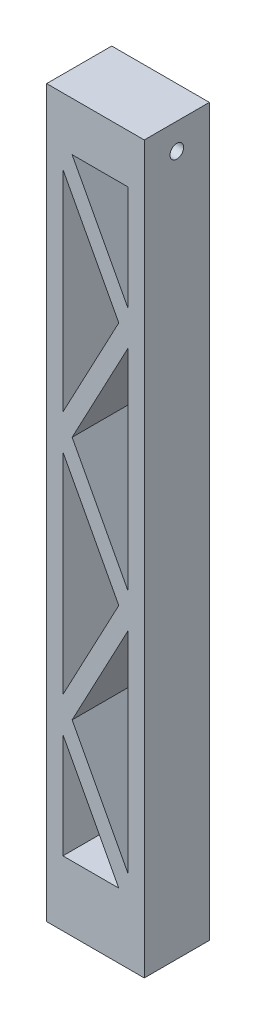
ISO-10303-21;
HEADER;
FILE_DESCRIPTION(('STEP AP214'),'2;1');
FILE_NAME('part.step','',(''),(''),'','','');
FILE_SCHEMA(('AUTOMOTIVE_DESIGN { 1 0 10303 214 1 1 1 1 }'));
ENDSEC;
DATA;
#1=APPLICATION_CONTEXT('core data for automotive mechanical design processes');
#2=APPLICATION_PROTOCOL_DEFINITION('international standard','automotive_design',2000,#1);
#3=PRODUCT_CONTEXT('',#1,'mechanical');
#4=PRODUCT('Part','Part','',(#3));
#5=PRODUCT_RELATED_PRODUCT_CATEGORY('part','',(#4));
#6=PRODUCT_DEFINITION_FORMATION('','',#4);
#7=PRODUCT_DEFINITION_CONTEXT('part definition',#1,'design');
#8=PRODUCT_DEFINITION('design','',#6,#7);
#9=PRODUCT_DEFINITION_SHAPE('','',#8);
#10=(LENGTH_UNIT() NAMED_UNIT(*) SI_UNIT(.MILLI.,.METRE.));
#11=(NAMED_UNIT(*) PLANE_ANGLE_UNIT() SI_UNIT($,.RADIAN.));
#12=(NAMED_UNIT(*) SI_UNIT($,.STERADIAN.) SOLID_ANGLE_UNIT());
#13=UNCERTAINTY_MEASURE_WITH_UNIT(LENGTH_MEASURE(1.E-05),#10,'distance_accuracy_value','');
#14=(GEOMETRIC_REPRESENTATION_CONTEXT(3) GLOBAL_UNCERTAINTY_ASSIGNED_CONTEXT((#13)) GLOBAL_UNIT_ASSIGNED_CONTEXT((#10,
#11,#12)) REPRESENTATION_CONTEXT('',''));
#15=CARTESIAN_POINT('',(0.,0.,0.));
#16=DIRECTION('',(0.,0.,1.));
#17=DIRECTION('',(1.,0.,0.));
#18=AXIS2_PLACEMENT_3D('',#15,#16,#17);
#19=CARTESIAN_POINT('',(-15.,223.,-10.));
#20=DIRECTION('',(0.,0.,1.));
#21=DIRECTION('',(1.,0.,0.));
#22=AXIS2_PLACEMENT_3D('',#19,#20,#21);
#23=PLANE('',#22);
#24=DIRECTION('',(0.,-1.,0.));
#25=VECTOR('',#24,1.);
#26=CARTESIAN_POINT('',(10.,0.,-10.));
#27=LINE('',#26,#25);
#28=CARTESIAN_POINT('',(10.,208.,-10.));
#29=VERTEX_POINT('',#28);
#30=CARTESIAN_POINT('',(10.,175.723532661682,-10.));
#31=VERTEX_POINT('',#30);
#32=EDGE_CURVE('E321',#29,#31,#27,.T.);
#33=ORIENTED_EDGE('',*,*,#32,.F.);
#34=DIRECTION('',(1.,0.,0.));
#35=VECTOR('',#34,1.);
#36=CARTESIAN_POINT('',(0.,208.,-10.));
#37=LINE('',#36,#35);
#38=CARTESIAN_POINT('',(-7.16833369059441,208.,-10.));
#39=VERTEX_POINT('',#38);
#40=EDGE_CURVE('E148',#39,#29,#37,.T.);
#41=ORIENTED_EDGE('',*,*,#40,.F.);
#42=DIRECTION('',(0.46961297297834,-0.88287238919928,0.));
#43=VECTOR('',#42,1.);
#44=CARTESIAN_POINT('',(80.6510765269855,42.8995087909497,-10.));
#45=LINE('',#44,#43);
#46=EDGE_CURVE('E314',#39,#31,#45,.T.);
#47=ORIENTED_EDGE('',*,*,#46,.T.);
#48=EDGE_LOOP('',(#33,#41,#47));
#49=FACE_BOUND('',#48,.T.);
#50=DIRECTION('',(-0.46961297297834,-0.88287238919928,0.));
#51=VECTOR('',#50,1.);
#52=CARTESIAN_POINT('',(-60.6474414687802,32.2592773770107,-10.));
#53=LINE('',#52,#51);
#54=CARTESIAN_POINT('',(10.,165.076467338318,-10.));
#55=VERTEX_POINT('',#54);
#56=CARTESIAN_POINT('',(-7.16833369059443,132.8,-10.));
#57=VERTEX_POINT('',#56);
#58=EDGE_CURVE('E349',#55,#57,#53,.T.);
#59=ORIENTED_EDGE('',*,*,#58,.T.);
#60=DIRECTION('',(0.46961297297834,-0.88287238919928,0.));
#61=VECTOR('',#60,1.);
#62=CARTESIAN_POINT('',(49.4725303025677,26.3151756928551,-10.));
#63=LINE('',#62,#61);
#64=CARTESIAN_POINT('',(10.,100.523532661682,-10.));
#65=VERTEX_POINT('',#64);
#66=EDGE_CURVE('E357',#57,#65,#63,.T.);
#67=ORIENTED_EDGE('',*,*,#66,.T.);
#68=DIRECTION('',(0.,-1.,0.));
#69=VECTOR('',#68,1.);
#70=CARTESIAN_POINT('',(9.99999999999999,0.,-10.));
#71=LINE('',#70,#69);
#72=EDGE_CURVE('E366',#55,#65,#71,.T.);
#73=ORIENTED_EDGE('',*,*,#72,.F.);
#74=EDGE_LOOP('',(#59,#67,#73));
#75=FACE_BOUND('',#74,.T.);
#76=DIRECTION('',(-0.46961297297834,-0.88287238919928,0.));
#77=VECTOR('',#76,1.);
#78=CARTESIAN_POINT('',(-29.4688952443624,15.6749442789162,-10.));
#79=LINE('',#78,#77);
#80=CARTESIAN_POINT('',(10.,89.8764673383176,-10.));
#81=VERTEX_POINT('',#80);
#82=CARTESIAN_POINT('',(-7.16833369059443,57.6,-10.));
#83=VERTEX_POINT('',#82);
#84=EDGE_CURVE('E398',#81,#83,#79,.T.);
#85=ORIENTED_EDGE('',*,*,#84,.T.);
#86=DIRECTION('',(0.46961297297834,-0.88287238919928,0.));
#87=VECTOR('',#86,1.);
#88=CARTESIAN_POINT('',(18.2939840781499,9.73084259476057,-10.));
#89=LINE('',#88,#87);
#90=CARTESIAN_POINT('',(10.,25.3235326616824,-10.));
#91=VERTEX_POINT('',#90);
#92=EDGE_CURVE('E406',#83,#91,#89,.T.);
#93=ORIENTED_EDGE('',*,*,#92,.T.);
#94=DIRECTION('',(0.,-1.,0.));
#95=VECTOR('',#94,1.);
#96=CARTESIAN_POINT('',(10.,0.,-10.));
#97=LINE('',#96,#95);
#98=EDGE_CURVE('E415',#81,#91,#97,.T.);
#99=ORIENTED_EDGE('',*,*,#98,.F.);
#100=EDGE_LOOP('',(#85,#93,#99));
#101=FACE_BOUND('',#100,.T.);
#102=DIRECTION('',(0.,1.,0.));
#103=VECTOR('',#102,1.);
#104=CARTESIAN_POINT('',(-10.,0.,-10.));
#105=LINE('',#104,#103);
#106=CARTESIAN_POINT('',(-10.,20.,-10.));
#107=VERTEX_POINT('',#106);
#108=CARTESIAN_POINT('',(-9.99999999999997,52.2764673383175,-10.));
#109=VERTEX_POINT('',#108);
#110=EDGE_CURVE('E440',#107,#109,#105,.T.);
#111=ORIENTED_EDGE('',*,*,#110,.F.);
#112=DIRECTION('',(-1.,0.,0.));
#113=VECTOR('',#112,1.);
#114=CARTESIAN_POINT('',(0.,20.,-10.));
#115=LINE('',#114,#113);
#116=CARTESIAN_POINT('',(7.16833369059444,20.,-10.));
#117=VERTEX_POINT('',#116);
#118=EDGE_CURVE('E423',#117,#107,#115,.T.);
#119=ORIENTED_EDGE('',*,*,#118,.F.);
#120=DIRECTION('',(0.469612972978341,-0.88287238919928,0.));
#121=VECTOR('',#120,1.);
#122=CARTESIAN_POINT('',(13.8796221321535,7.38277772986891,-10.));
#123=LINE('',#122,#121);
#124=EDGE_CURVE('E432',#109,#117,#123,.T.);
#125=ORIENTED_EDGE('',*,*,#124,.F.);
#126=EDGE_LOOP('',(#111,#119,#125));
#127=FACE_BOUND('',#126,.T.);
#128=DIRECTION('',(-1.,0.,0.));
#129=VECTOR('',#128,1.);
#130=CARTESIAN_POINT('',(-15.,0.,-10.));
#131=LINE('',#130,#129);
#132=CARTESIAN_POINT('',(15.,0.,-10.));
#133=VERTEX_POINT('',#132);
#134=CARTESIAN_POINT('',(-15.,0.,-10.));
#135=VERTEX_POINT('',#134);
#136=EDGE_CURVE('E465',#133,#135,#131,.T.);
#137=ORIENTED_EDGE('',*,*,#136,.T.);
#138=DIRECTION('',(0.,-1.,0.));
#139=VECTOR('',#138,1.);
#140=CARTESIAN_POINT('',(-15.,223.,-10.));
#141=LINE('',#140,#139);
#142=CARTESIAN_POINT('',(-15.,223.,-10.));
#143=VERTEX_POINT('',#142);
#144=EDGE_CURVE('E141',#143,#135,#141,.T.);
#145=ORIENTED_EDGE('',*,*,#144,.F.);
#146=DIRECTION('',(-1.,0.,0.));
#147=VECTOR('',#146,1.);
#148=CARTESIAN_POINT('',(-15.,223.,-10.));
#149=LINE('',#148,#147);
#150=CARTESIAN_POINT('',(15.,223.,-10.));
#151=VERTEX_POINT('',#150);
#152=EDGE_CURVE('E455',#151,#143,#149,.T.);
#153=ORIENTED_EDGE('',*,*,#152,.F.);
#154=DIRECTION('',(0.,-1.,0.));
#155=VECTOR('',#154,1.);
#156=CARTESIAN_POINT('',(15.,223.,-10.));
#157=LINE('',#156,#155);
#158=EDGE_CURVE('E12',#151,#133,#157,.T.);
#159=ORIENTED_EDGE('',*,*,#158,.T.);
#160=EDGE_LOOP('',(#137,#145,#153,#159));
#161=FACE_BOUND('',#160,.T.);
#162=DIRECTION('',(0.,-1.,0.));
#163=VECTOR('',#162,1.);
#164=CARTESIAN_POINT('',(-9.99999999999993,0.,-10.));
#165=LINE('',#164,#163);
#166=CARTESIAN_POINT('',(-10.,127.476467338318,-10.));
#167=VERTEX_POINT('',#166);
#168=CARTESIAN_POINT('',(-9.99999999999997,62.9235326616826,-10.));
#169=VERTEX_POINT('',#168);
#170=EDGE_CURVE('E374',#167,#169,#165,.T.);
#171=ORIENTED_EDGE('',*,*,#170,.T.);
#172=DIRECTION('',(-0.469612972978341,-0.882872389199279,0.));
#173=VECTOR('',#172,1.);
#174=CARTESIAN_POINT('',(-33.8832571903589,18.023009143808,-10.));
#175=LINE('',#174,#173);
#176=CARTESIAN_POINT('',(7.16833369059443,95.2,-10.));
#177=VERTEX_POINT('',#176);
#178=EDGE_CURVE('E382',#177,#169,#175,.T.);
#179=ORIENTED_EDGE('',*,*,#178,.F.);
#180=DIRECTION('',(0.46961297297834,-0.88287238919928,0.));
#181=VECTOR('',#180,1.);
#182=CARTESIAN_POINT('',(45.0581683565713,23.9671108279634,-10.));
#183=LINE('',#182,#181);
#184=EDGE_CURVE('E391',#167,#177,#183,.T.);
#185=ORIENTED_EDGE('',*,*,#184,.F.);
#186=EDGE_LOOP('',(#171,#179,#185));
#187=FACE_BOUND('',#186,.T.);
#188=DIRECTION('',(0.,-1.,0.));
#189=VECTOR('',#188,1.);
#190=CARTESIAN_POINT('',(-9.99999999999997,0.,-10.));
#191=LINE('',#190,#189);
#192=CARTESIAN_POINT('',(-9.99999999999999,202.676467338318,-10.));
#193=VERTEX_POINT('',#192);
#194=CARTESIAN_POINT('',(-9.99999999999999,138.123532661683,-10.));
#195=VERTEX_POINT('',#194);
#196=EDGE_CURVE('E327',#193,#195,#191,.T.);
#197=ORIENTED_EDGE('',*,*,#196,.T.);
#198=DIRECTION('',(-0.469612972978341,-0.88287238919928,0.));
#199=VECTOR('',#198,1.);
#200=CARTESIAN_POINT('',(-65.0618034147766,34.6073422419025,-10.));
#201=LINE('',#200,#199);
#202=CARTESIAN_POINT('',(7.16833369059444,170.4,-10.));
#203=VERTEX_POINT('',#202);
#204=EDGE_CURVE('E333',#203,#195,#201,.T.);
#205=ORIENTED_EDGE('',*,*,#204,.F.);
#206=DIRECTION('',(0.46961297297834,-0.88287238919928,0.));
#207=VECTOR('',#206,1.);
#208=CARTESIAN_POINT('',(76.2367145809891,40.551443926058,-10.));
#209=LINE('',#208,#207);
#210=EDGE_CURVE('E342',#193,#203,#209,.T.);
#211=ORIENTED_EDGE('',*,*,#210,.F.);
#212=EDGE_LOOP('',(#197,#205,#211));
#213=FACE_BOUND('',#212,.T.);
#214=ADVANCED_FACE('F133',(#49,#75,#101,#127,#161,#187,#213),#23,.F.);
#215=CARTESIAN_POINT('',(-15.,223.,10.));
#216=DIRECTION('',(0.,0.,-1.));
#217=DIRECTION('',(-1.,0.,0.));
#218=AXIS2_PLACEMENT_3D('',#215,#216,#217);
#219=PLANE('',#218);
#220=DIRECTION('',(0.46961297297834,-0.88287238919928,0.));
#221=VECTOR('',#220,1.);
#222=CARTESIAN_POINT('',(80.6510765269855,42.8995087909497,10.));
#223=LINE('',#222,#221);
#224=CARTESIAN_POINT('',(-7.16833369059441,208.,10.));
#225=VERTEX_POINT('',#224);
#226=CARTESIAN_POINT('',(10.,175.723532661682,10.));
#227=VERTEX_POINT('',#226);
#228=EDGE_CURVE('E317',#225,#227,#223,.T.);
#229=ORIENTED_EDGE('',*,*,#228,.F.);
#230=DIRECTION('',(1.,0.,0.));
#231=VECTOR('',#230,1.);
#232=CARTESIAN_POINT('',(0.,208.,10.));
#233=LINE('',#232,#231);
#234=CARTESIAN_POINT('',(10.,208.,10.));
#235=VERTEX_POINT('',#234);
#236=EDGE_CURVE('E310',#225,#235,#233,.T.);
#237=ORIENTED_EDGE('',*,*,#236,.T.);
#238=DIRECTION('',(0.,-1.,0.));
#239=VECTOR('',#238,1.);
#240=CARTESIAN_POINT('',(10.,0.,10.));
#241=LINE('',#240,#239);
#242=EDGE_CURVE('E313',#235,#227,#241,.T.);
#243=ORIENTED_EDGE('',*,*,#242,.T.);
#244=EDGE_LOOP('',(#229,#237,#243));
#245=FACE_BOUND('',#244,.T.);
#246=DIRECTION('',(-0.46961297297834,-0.88287238919928,0.));
#247=VECTOR('',#246,1.);
#248=CARTESIAN_POINT('',(-60.6474414687802,32.2592773770107,10.));
#249=LINE('',#248,#247);
#250=CARTESIAN_POINT('',(10.,165.076467338318,10.));
#251=VERTEX_POINT('',#250);
#252=CARTESIAN_POINT('',(-7.16833369059443,132.8,10.));
#253=VERTEX_POINT('',#252);
#254=EDGE_CURVE('E354',#251,#253,#249,.T.);
#255=ORIENTED_EDGE('',*,*,#254,.F.);
#256=DIRECTION('',(0.,-1.,0.));
#257=VECTOR('',#256,1.);
#258=CARTESIAN_POINT('',(9.99999999999999,0.,10.));
#259=LINE('',#258,#257);
#260=CARTESIAN_POINT('',(10.,100.523532661682,10.));
#261=VERTEX_POINT('',#260);
#262=EDGE_CURVE('E356',#251,#261,#259,.T.);
#263=ORIENTED_EDGE('',*,*,#262,.T.);
#264=DIRECTION('',(0.46961297297834,-0.88287238919928,0.));
#265=VECTOR('',#264,1.);
#266=CARTESIAN_POINT('',(49.4725303025677,26.3151756928551,10.));
#267=LINE('',#266,#265);
#268=EDGE_CURVE('E360',#253,#261,#267,.T.);
#269=ORIENTED_EDGE('',*,*,#268,.F.);
#270=EDGE_LOOP('',(#255,#263,#269));
#271=FACE_BOUND('',#270,.T.);
#272=DIRECTION('',(-0.46961297297834,-0.88287238919928,0.));
#273=VECTOR('',#272,1.);
#274=CARTESIAN_POINT('',(-29.4688952443624,15.6749442789162,10.));
#275=LINE('',#274,#273);
#276=CARTESIAN_POINT('',(10.,89.8764673383176,10.));
#277=VERTEX_POINT('',#276);
#278=CARTESIAN_POINT('',(-7.16833369059443,57.6,10.));
#279=VERTEX_POINT('',#278);
#280=EDGE_CURVE('E403',#277,#279,#275,.T.);
#281=ORIENTED_EDGE('',*,*,#280,.F.);
#282=DIRECTION('',(0.,-1.,0.));
#283=VECTOR('',#282,1.);
#284=CARTESIAN_POINT('',(10.,0.,10.));
#285=LINE('',#284,#283);
#286=CARTESIAN_POINT('',(10.,25.3235326616824,10.));
#287=VERTEX_POINT('',#286);
#288=EDGE_CURVE('E405',#277,#287,#285,.T.);
#289=ORIENTED_EDGE('',*,*,#288,.T.);
#290=DIRECTION('',(0.46961297297834,-0.88287238919928,0.));
#291=VECTOR('',#290,1.);
#292=CARTESIAN_POINT('',(18.2939840781499,9.73084259476057,10.));
#293=LINE('',#292,#291);
#294=EDGE_CURVE('E409',#279,#287,#293,.T.);
#295=ORIENTED_EDGE('',*,*,#294,.F.);
#296=EDGE_LOOP('',(#281,#289,#295));
#297=FACE_BOUND('',#296,.T.);
#298=DIRECTION('',(0.469612972978341,-0.88287238919928,0.));
#299=VECTOR('',#298,1.);
#300=CARTESIAN_POINT('',(13.8796221321535,7.38277772986891,10.));
#301=LINE('',#300,#299);
#302=CARTESIAN_POINT('',(-9.99999999999998,52.2764673383175,10.));
#303=VERTEX_POINT('',#302);
#304=CARTESIAN_POINT('',(7.16833369059444,20.,10.));
#305=VERTEX_POINT('',#304);
#306=EDGE_CURVE('E435',#303,#305,#301,.T.);
#307=ORIENTED_EDGE('',*,*,#306,.T.);
#308=DIRECTION('',(-1.,0.,0.));
#309=VECTOR('',#308,1.);
#310=CARTESIAN_POINT('',(0.,20.,10.));
#311=LINE('',#310,#309);
#312=CARTESIAN_POINT('',(-10.,20.,10.));
#313=VERTEX_POINT('',#312);
#314=EDGE_CURVE('E428',#305,#313,#311,.T.);
#315=ORIENTED_EDGE('',*,*,#314,.T.);
#316=DIRECTION('',(0.,1.,0.));
#317=VECTOR('',#316,1.);
#318=CARTESIAN_POINT('',(-10.,0.,10.));
#319=LINE('',#318,#317);
#320=EDGE_CURVE('E431',#313,#303,#319,.T.);
#321=ORIENTED_EDGE('',*,*,#320,.T.);
#322=EDGE_LOOP('',(#307,#315,#321));
#323=FACE_BOUND('',#322,.T.);
#324=DIRECTION('',(1.,0.,0.));
#325=VECTOR('',#324,1.);
#326=CARTESIAN_POINT('',(-15.,0.,10.));
#327=LINE('',#326,#325);
#328=CARTESIAN_POINT('',(-15.,0.,10.));
#329=VERTEX_POINT('',#328);
#330=CARTESIAN_POINT('',(15.,0.,10.));
#331=VERTEX_POINT('',#330);
#332=EDGE_CURVE('E456',#329,#331,#327,.T.);
#333=ORIENTED_EDGE('',*,*,#332,.T.);
#334=DIRECTION('',(0.,-1.,0.));
#335=VECTOR('',#334,1.);
#336=CARTESIAN_POINT('',(15.,223.,10.));
#337=LINE('',#336,#335);
#338=CARTESIAN_POINT('',(15.,223.,10.));
#339=VERTEX_POINT('',#338);
#340=EDGE_CURVE('E462',#339,#331,#337,.T.);
#341=ORIENTED_EDGE('',*,*,#340,.F.);
#342=DIRECTION('',(1.,0.,0.));
#343=VECTOR('',#342,1.);
#344=CARTESIAN_POINT('',(-15.,223.,10.));
#345=LINE('',#344,#343);
#346=CARTESIAN_POINT('',(-15.,223.,10.));
#347=VERTEX_POINT('',#346);
#348=EDGE_CURVE('E460',#347,#339,#345,.T.);
#349=ORIENTED_EDGE('',*,*,#348,.F.);
#350=DIRECTION('',(0.,-1.,0.));
#351=VECTOR('',#350,1.);
#352=CARTESIAN_POINT('',(-15.,223.,10.));
#353=LINE('',#352,#351);
#354=EDGE_CURVE('E472',#347,#329,#353,.T.);
#355=ORIENTED_EDGE('',*,*,#354,.T.);
#356=EDGE_LOOP('',(#333,#341,#349,#355));
#357=FACE_BOUND('',#356,.T.);
#358=DIRECTION('',(0.,-1.,0.));
#359=VECTOR('',#358,1.);
#360=CARTESIAN_POINT('',(-9.99999999999993,0.,10.));
#361=LINE('',#360,#359);
#362=CARTESIAN_POINT('',(-10.,127.476467338318,10.));
#363=VERTEX_POINT('',#362);
#364=CARTESIAN_POINT('',(-9.99999999999997,62.9235326616826,10.));
#365=VERTEX_POINT('',#364);
#366=EDGE_CURVE('E379',#363,#365,#361,.T.);
#367=ORIENTED_EDGE('',*,*,#366,.F.);
#368=DIRECTION('',(0.46961297297834,-0.88287238919928,0.));
#369=VECTOR('',#368,1.);
#370=CARTESIAN_POINT('',(45.0581683565713,23.9671108279634,10.));
#371=LINE('',#370,#369);
#372=CARTESIAN_POINT('',(7.16833369059445,95.2,10.));
#373=VERTEX_POINT('',#372);
#374=EDGE_CURVE('E381',#363,#373,#371,.T.);
#375=ORIENTED_EDGE('',*,*,#374,.T.);
#376=DIRECTION('',(-0.469612972978341,-0.882872389199279,0.));
#377=VECTOR('',#376,1.);
#378=CARTESIAN_POINT('',(-33.8832571903589,18.023009143808,10.));
#379=LINE('',#378,#377);
#380=EDGE_CURVE('E385',#373,#365,#379,.T.);
#381=ORIENTED_EDGE('',*,*,#380,.T.);
#382=EDGE_LOOP('',(#367,#375,#381));
#383=FACE_BOUND('',#382,.T.);
#384=DIRECTION('',(0.,-1.,0.));
#385=VECTOR('',#384,1.);
#386=CARTESIAN_POINT('',(-9.99999999999997,0.,10.));
#387=LINE('',#386,#385);
#388=CARTESIAN_POINT('',(-9.99999999999998,202.676467338318,10.));
#389=VERTEX_POINT('',#388);
#390=CARTESIAN_POINT('',(-9.99999999999999,138.123532661683,10.));
#391=VERTEX_POINT('',#390);
#392=EDGE_CURVE('E330',#389,#391,#387,.T.);
#393=ORIENTED_EDGE('',*,*,#392,.F.);
#394=DIRECTION('',(0.46961297297834,-0.88287238919928,0.));
#395=VECTOR('',#394,1.);
#396=CARTESIAN_POINT('',(76.2367145809891,40.551443926058,10.));
#397=LINE('',#396,#395);
#398=CARTESIAN_POINT('',(7.16833369059445,170.4,10.));
#399=VERTEX_POINT('',#398);
#400=EDGE_CURVE('E332',#389,#399,#397,.T.);
#401=ORIENTED_EDGE('',*,*,#400,.T.);
#402=DIRECTION('',(-0.469612972978341,-0.88287238919928,0.));
#403=VECTOR('',#402,1.);
#404=CARTESIAN_POINT('',(-65.0618034147766,34.6073422419025,10.));
#405=LINE('',#404,#403);
#406=EDGE_CURVE('E336',#399,#391,#405,.T.);
#407=ORIENTED_EDGE('',*,*,#406,.T.);
#408=EDGE_LOOP('',(#393,#401,#407));
#409=FACE_BOUND('',#408,.T.);
#410=ADVANCED_FACE('F488',(#245,#271,#297,#323,#357,#383,#409),#219,.F.);
#411=CARTESIAN_POINT('',(15.,223.,10.));
#412=DIRECTION('',(-1.,0.,0.));
#413=DIRECTION('',(0.,0.,1.));
#414=AXIS2_PLACEMENT_3D('',#411,#412,#413);
#415=PLANE('',#414);
#416=CARTESIAN_POINT('',(15.,215.,0.));
#417=DIRECTION('',(1.,0.,0.));
#418=DIRECTION('',(0.,0.,-1.));
#419=AXIS2_PLACEMENT_3D('',#416,#417,#418);
#420=CIRCLE('',#419,2.09999999999999);
#421=CARTESIAN_POINT('',(15.,215.,-2.09999999999999));
#422=VERTEX_POINT('',#421);
#423=EDGE_CURVE('E592',#422,#422,#420,.T.);
#424=ORIENTED_EDGE('',*,*,#423,.F.);
#425=EDGE_LOOP('',(#424));
#426=FACE_BOUND('',#425,.T.);
#427=DIRECTION('',(0.,0.,-1.));
#428=VECTOR('',#427,1.);
#429=CARTESIAN_POINT('',(15.,0.,10.));
#430=LINE('',#429,#428);
#431=EDGE_CURVE('E447',#331,#133,#430,.T.);
#432=ORIENTED_EDGE('',*,*,#431,.T.);
#433=ORIENTED_EDGE('',*,*,#158,.F.);
#434=DIRECTION('',(0.,0.,-1.));
#435=VECTOR('',#434,1.);
#436=CARTESIAN_POINT('',(15.,223.,10.));
#437=LINE('',#436,#435);
#438=EDGE_CURVE('E452',#339,#151,#437,.T.);
#439=ORIENTED_EDGE('',*,*,#438,.F.);
#440=ORIENTED_EDGE('',*,*,#340,.T.);
#441=EDGE_LOOP('',(#432,#433,#439,#440));
#442=FACE_BOUND('',#441,.T.);
#443=ADVANCED_FACE('F135',(#426,#442),#415,.F.);
#444=CARTESIAN_POINT('',(-15.,223.,10.));
#445=DIRECTION('',(1.,0.,0.));
#446=DIRECTION('',(0.,0.,-1.));
#447=AXIS2_PLACEMENT_3D('',#444,#445,#446);
#448=PLANE('',#447);
#449=CARTESIAN_POINT('',(-15.,215.,0.));
#450=DIRECTION('',(1.,0.,0.));
#451=DIRECTION('',(0.,0.,-1.));
#452=AXIS2_PLACEMENT_3D('',#449,#450,#451);
#453=CIRCLE('',#452,2.09999999999999);
#454=CARTESIAN_POINT('',(-15.,215.,-2.09999999999999));
#455=VERTEX_POINT('',#454);
#456=EDGE_CURVE('E304',#455,#455,#453,.T.);
#457=ORIENTED_EDGE('',*,*,#456,.T.);
#458=EDGE_LOOP('',(#457));
#459=FACE_BOUND('',#458,.T.);
#460=DIRECTION('',(0.,0.,1.));
#461=VECTOR('',#460,1.);
#462=CARTESIAN_POINT('',(-15.,0.,10.));
#463=LINE('',#462,#461);
#464=EDGE_CURVE('E467',#135,#329,#463,.T.);
#465=ORIENTED_EDGE('',*,*,#464,.T.);
#466=ORIENTED_EDGE('',*,*,#354,.F.);
#467=DIRECTION('',(0.,0.,1.));
#468=VECTOR('',#467,1.);
#469=CARTESIAN_POINT('',(-15.,223.,10.));
#470=LINE('',#469,#468);
#471=EDGE_CURVE('E458',#143,#347,#470,.T.);
#472=ORIENTED_EDGE('',*,*,#471,.F.);
#473=ORIENTED_EDGE('',*,*,#144,.T.);
#474=EDGE_LOOP('',(#465,#466,#472,#473));
#475=FACE_BOUND('',#474,.T.);
#476=ADVANCED_FACE('F479',(#459,#475),#448,.F.);
#477=CARTESIAN_POINT('',(0.,223.,0.));
#478=DIRECTION('',(0.,-1.,0.));
#479=DIRECTION('',(0.,0.,-1.));
#480=AXIS2_PLACEMENT_3D('',#477,#478,#479);
#481=PLANE('',#480);
#482=ORIENTED_EDGE('',*,*,#438,.T.);
#483=ORIENTED_EDGE('',*,*,#152,.T.);
#484=ORIENTED_EDGE('',*,*,#471,.T.);
#485=ORIENTED_EDGE('',*,*,#348,.T.);
#486=EDGE_LOOP('',(#482,#483,#484,#485));
#487=FACE_BOUND('',#486,.T.);
#488=ADVANCED_FACE('F495',(#487),#481,.F.);
#489=CARTESIAN_POINT('',(0.,0.,0.));
#490=DIRECTION('',(0.,-1.,0.));
#491=DIRECTION('',(0.,0.,-1.));
#492=AXIS2_PLACEMENT_3D('',#489,#490,#491);
#493=PLANE('',#492);
#494=CARTESIAN_POINT('',(-8.,0.,0.));
#495=DIRECTION('',(0.,-1.,0.));
#496=DIRECTION('',(0.,0.,-1.));
#497=AXIS2_PLACEMENT_3D('',#494,#495,#496);
#498=CIRCLE('',#497,2.09999999999999);
#499=CARTESIAN_POINT('',(-8.,0.,-2.09999999999999));
#500=VERTEX_POINT('',#499);
#501=EDGE_CURVE('E298',#500,#500,#498,.T.);
#502=ORIENTED_EDGE('',*,*,#501,.F.);
#503=EDGE_LOOP('',(#502));
#504=FACE_BOUND('',#503,.T.);
#505=CARTESIAN_POINT('',(8.,0.,0.));
#506=DIRECTION('',(0.,-1.,0.));
#507=DIRECTION('',(0.,0.,-1.));
#508=AXIS2_PLACEMENT_3D('',#505,#506,#507);
#509=CIRCLE('',#508,2.09999999999999);
#510=CARTESIAN_POINT('',(8.,0.,-2.09999999999999));
#511=VERTEX_POINT('',#510);
#512=EDGE_CURVE('E297',#511,#511,#509,.T.);
#513=ORIENTED_EDGE('',*,*,#512,.F.);
#514=EDGE_LOOP('',(#513));
#515=FACE_BOUND('',#514,.T.);
#516=ORIENTED_EDGE('',*,*,#431,.F.);
#517=ORIENTED_EDGE('',*,*,#332,.F.);
#518=ORIENTED_EDGE('',*,*,#464,.F.);
#519=ORIENTED_EDGE('',*,*,#136,.F.);
#520=EDGE_LOOP('',(#516,#517,#518,#519));
#521=FACE_BOUND('',#520,.T.);
#522=ADVANCED_FACE('F485',(#504,#515,#521),#493,.T.);
#523=CARTESIAN_POINT('',(0.,20.,10.));
#524=DIRECTION('',(0.,-1.,0.));
#525=DIRECTION('',(1.,0.,0.));
#526=AXIS2_PLACEMENT_3D('',#523,#524,#525);
#527=PLANE('',#526);
#528=ORIENTED_EDGE('',*,*,#118,.T.);
#529=DIRECTION('',(0.,0.,-1.));
#530=VECTOR('',#529,1.);
#531=CARTESIAN_POINT('',(-10.,20.,10.));
#532=LINE('',#531,#530);
#533=EDGE_CURVE('E438',#313,#107,#532,.T.);
#534=ORIENTED_EDGE('',*,*,#533,.F.);
#535=ORIENTED_EDGE('',*,*,#314,.F.);
#536=DIRECTION('',(0.,0.,-1.));
#537=VECTOR('',#536,1.);
#538=CARTESIAN_POINT('',(7.16833369059444,20.,10.));
#539=LINE('',#538,#537);
#540=EDGE_CURVE('E445',#305,#117,#539,.T.);
#541=ORIENTED_EDGE('',*,*,#540,.T.);
#542=EDGE_LOOP('',(#528,#534,#535,#541));
#543=FACE_BOUND('',#542,.T.);
#544=ADVANCED_FACE('F567',(#543),#527,.F.);
#545=CARTESIAN_POINT('',(13.8796221321535,7.38277772986891,10.));
#546=DIRECTION('',(0.88287238919928,0.469612972978341,0.));
#547=DIRECTION('',(-0.469612972978341,0.88287238919928,0.));
#548=AXIS2_PLACEMENT_3D('',#545,#546,#547);
#549=PLANE('',#548);
#550=ORIENTED_EDGE('',*,*,#124,.T.);
#551=ORIENTED_EDGE('',*,*,#540,.F.);
#552=ORIENTED_EDGE('',*,*,#306,.F.);
#553=DIRECTION('',(0.,0.,-1.));
#554=VECTOR('',#553,1.);
#555=CARTESIAN_POINT('',(-9.99999999999997,52.2764673383175,10.));
#556=LINE('',#555,#554);
#557=EDGE_CURVE('E448',#303,#109,#556,.T.);
#558=ORIENTED_EDGE('',*,*,#557,.T.);
#559=EDGE_LOOP('',(#550,#551,#552,#558));
#560=FACE_BOUND('',#559,.T.);
#561=ADVANCED_FACE('F564',(#560),#549,.F.);
#562=CARTESIAN_POINT('',(-10.,0.,10.));
#563=DIRECTION('',(-1.,0.,0.));
#564=DIRECTION('',(0.,-1.,0.));
#565=AXIS2_PLACEMENT_3D('',#562,#563,#564);
#566=PLANE('',#565);
#567=ORIENTED_EDGE('',*,*,#110,.T.);
#568=ORIENTED_EDGE('',*,*,#557,.F.);
#569=ORIENTED_EDGE('',*,*,#320,.F.);
#570=ORIENTED_EDGE('',*,*,#533,.T.);
#571=EDGE_LOOP('',(#567,#568,#569,#570));
#572=FACE_BOUND('',#571,.T.);
#573=ADVANCED_FACE('F562',(#572),#566,.F.);
#574=CARTESIAN_POINT('',(-29.4688952443624,15.6749442789162,10.));
#575=DIRECTION('',(0.88287238919928,-0.46961297297834,0.));
#576=DIRECTION('',(0.46961297297834,0.88287238919928,0.));
#577=AXIS2_PLACEMENT_3D('',#574,#575,#576);
#578=PLANE('',#577);
#579=ORIENTED_EDGE('',*,*,#84,.F.);
#580=DIRECTION('',(0.,0.,-1.));
#581=VECTOR('',#580,1.);
#582=CARTESIAN_POINT('',(10.,89.8764673383176,10.));
#583=LINE('',#582,#581);
#584=EDGE_CURVE('E412',#277,#81,#583,.T.);
#585=ORIENTED_EDGE('',*,*,#584,.F.);
#586=ORIENTED_EDGE('',*,*,#280,.T.);
#587=DIRECTION('',(0.,0.,-1.));
#588=VECTOR('',#587,1.);
#589=CARTESIAN_POINT('',(-7.16833369059443,57.6,10.));
#590=LINE('',#589,#588);
#591=EDGE_CURVE('E420',#279,#83,#590,.T.);
#592=ORIENTED_EDGE('',*,*,#591,.T.);
#593=EDGE_LOOP('',(#579,#585,#586,#592));
#594=FACE_BOUND('',#593,.T.);
#595=ADVANCED_FACE('F555',(#594),#578,.T.);
#596=CARTESIAN_POINT('',(18.2939840781499,9.73084259476057,10.));
#597=DIRECTION('',(0.88287238919928,0.46961297297834,0.));
#598=DIRECTION('',(-0.46961297297834,0.88287238919928,0.));
#599=AXIS2_PLACEMENT_3D('',#596,#597,#598);
#600=PLANE('',#599);
#601=ORIENTED_EDGE('',*,*,#92,.F.);
#602=ORIENTED_EDGE('',*,*,#591,.F.);
#603=ORIENTED_EDGE('',*,*,#294,.T.);
#604=DIRECTION('',(0.,0.,-1.));
#605=VECTOR('',#604,1.);
#606=CARTESIAN_POINT('',(10.,25.3235326616824,10.));
#607=LINE('',#606,#605);
#608=EDGE_CURVE('E424',#287,#91,#607,.T.);
#609=ORIENTED_EDGE('',*,*,#608,.T.);
#610=EDGE_LOOP('',(#601,#602,#603,#609));
#611=FACE_BOUND('',#610,.T.);
#612=ADVANCED_FACE('F552',(#611),#600,.T.);
#613=CARTESIAN_POINT('',(10.,0.,10.));
#614=DIRECTION('',(1.,0.,0.));
#615=DIRECTION('',(0.,1.,0.));
#616=AXIS2_PLACEMENT_3D('',#613,#614,#615);
#617=PLANE('',#616);
#618=ORIENTED_EDGE('',*,*,#98,.T.);
#619=ORIENTED_EDGE('',*,*,#608,.F.);
#620=ORIENTED_EDGE('',*,*,#288,.F.);
#621=ORIENTED_EDGE('',*,*,#584,.T.);
#622=EDGE_LOOP('',(#618,#619,#620,#621));
#623=FACE_BOUND('',#622,.T.);
#624=ADVANCED_FACE('F550',(#623),#617,.F.);
#625=CARTESIAN_POINT('',(-9.99999999999993,0.,10.));
#626=DIRECTION('',(1.,0.,0.));
#627=DIRECTION('',(0.,1.,0.));
#628=AXIS2_PLACEMENT_3D('',#625,#626,#627);
#629=PLANE('',#628);
#630=ORIENTED_EDGE('',*,*,#170,.F.);
#631=DIRECTION('',(0.,0.,-1.));
#632=VECTOR('',#631,1.);
#633=CARTESIAN_POINT('',(-10.,127.476467338318,10.));
#634=LINE('',#633,#632);
#635=EDGE_CURVE('E388',#363,#167,#634,.T.);
#636=ORIENTED_EDGE('',*,*,#635,.F.);
#637=ORIENTED_EDGE('',*,*,#366,.T.);
#638=DIRECTION('',(0.,0.,-1.));
#639=VECTOR('',#638,1.);
#640=CARTESIAN_POINT('',(-9.99999999999997,62.9235326616826,10.));
#641=LINE('',#640,#639);
#642=EDGE_CURVE('E396',#365,#169,#641,.T.);
#643=ORIENTED_EDGE('',*,*,#642,.T.);
#644=EDGE_LOOP('',(#630,#636,#637,#643));
#645=FACE_BOUND('',#644,.T.);
#646=ADVANCED_FACE('F543',(#645),#629,.T.);
#647=CARTESIAN_POINT('',(-33.8832571903589,18.023009143808,10.));
#648=DIRECTION('',(0.882872389199279,-0.469612972978341,0.));
#649=DIRECTION('',(0.469612972978341,0.882872389199279,0.));
#650=AXIS2_PLACEMENT_3D('',#647,#648,#649);
#651=PLANE('',#650);
#652=ORIENTED_EDGE('',*,*,#178,.T.);
#653=ORIENTED_EDGE('',*,*,#642,.F.);
#654=ORIENTED_EDGE('',*,*,#380,.F.);
#655=DIRECTION('',(0.,0.,-1.));
#656=VECTOR('',#655,1.);
#657=CARTESIAN_POINT('',(7.16833369059443,95.2,10.));
#658=LINE('',#657,#656);
#659=EDGE_CURVE('E399',#373,#177,#658,.T.);
#660=ORIENTED_EDGE('',*,*,#659,.T.);
#661=EDGE_LOOP('',(#652,#653,#654,#660));
#662=FACE_BOUND('',#661,.T.);
#663=ADVANCED_FACE('F540',(#662),#651,.F.);
#664=CARTESIAN_POINT('',(45.0581683565713,23.9671108279634,10.));
#665=DIRECTION('',(0.88287238919928,0.46961297297834,0.));
#666=DIRECTION('',(-0.46961297297834,0.88287238919928,0.));
#667=AXIS2_PLACEMENT_3D('',#664,#665,#666);
#668=PLANE('',#667);
#669=ORIENTED_EDGE('',*,*,#184,.T.);
#670=ORIENTED_EDGE('',*,*,#659,.F.);
#671=ORIENTED_EDGE('',*,*,#374,.F.);
#672=ORIENTED_EDGE('',*,*,#635,.T.);
#673=EDGE_LOOP('',(#669,#670,#671,#672));
#674=FACE_BOUND('',#673,.T.);
#675=ADVANCED_FACE('F538',(#674),#668,.F.);
#676=CARTESIAN_POINT('',(-60.6474414687802,32.2592773770107,10.));
#677=DIRECTION('',(0.88287238919928,-0.46961297297834,0.));
#678=DIRECTION('',(0.46961297297834,0.88287238919928,0.));
#679=AXIS2_PLACEMENT_3D('',#676,#677,#678);
#680=PLANE('',#679);
#681=ORIENTED_EDGE('',*,*,#58,.F.);
#682=DIRECTION('',(0.,0.,-1.));
#683=VECTOR('',#682,1.);
#684=CARTESIAN_POINT('',(10.,165.076467338318,10.));
#685=LINE('',#684,#683);
#686=EDGE_CURVE('E363',#251,#55,#685,.T.);
#687=ORIENTED_EDGE('',*,*,#686,.F.);
#688=ORIENTED_EDGE('',*,*,#254,.T.);
#689=DIRECTION('',(0.,0.,-1.));
#690=VECTOR('',#689,1.);
#691=CARTESIAN_POINT('',(-7.16833369059443,132.8,10.));
#692=LINE('',#691,#690);
#693=EDGE_CURVE('E371',#253,#57,#692,.T.);
#694=ORIENTED_EDGE('',*,*,#693,.T.);
#695=EDGE_LOOP('',(#681,#687,#688,#694));
#696=FACE_BOUND('',#695,.T.);
#697=ADVANCED_FACE('F531',(#696),#680,.T.);
#698=CARTESIAN_POINT('',(49.4725303025677,26.3151756928551,10.));
#699=DIRECTION('',(0.88287238919928,0.46961297297834,0.));
#700=DIRECTION('',(-0.46961297297834,0.88287238919928,0.));
#701=AXIS2_PLACEMENT_3D('',#698,#699,#700);
#702=PLANE('',#701);
#703=ORIENTED_EDGE('',*,*,#66,.F.);
#704=ORIENTED_EDGE('',*,*,#693,.F.);
#705=ORIENTED_EDGE('',*,*,#268,.T.);
#706=DIRECTION('',(0.,0.,-1.));
#707=VECTOR('',#706,1.);
#708=CARTESIAN_POINT('',(10.,100.523532661682,10.));
#709=LINE('',#708,#707);
#710=EDGE_CURVE('E375',#261,#65,#709,.T.);
#711=ORIENTED_EDGE('',*,*,#710,.T.);
#712=EDGE_LOOP('',(#703,#704,#705,#711));
#713=FACE_BOUND('',#712,.T.);
#714=ADVANCED_FACE('F528',(#713),#702,.T.);
#715=CARTESIAN_POINT('',(9.99999999999999,0.,10.));
#716=DIRECTION('',(1.,0.,0.));
#717=DIRECTION('',(0.,1.,0.));
#718=AXIS2_PLACEMENT_3D('',#715,#716,#717);
#719=PLANE('',#718);
#720=ORIENTED_EDGE('',*,*,#72,.T.);
#721=ORIENTED_EDGE('',*,*,#710,.F.);
#722=ORIENTED_EDGE('',*,*,#262,.F.);
#723=ORIENTED_EDGE('',*,*,#686,.T.);
#724=EDGE_LOOP('',(#720,#721,#722,#723));
#725=FACE_BOUND('',#724,.T.);
#726=ADVANCED_FACE('F523',(#725),#719,.F.);
#727=CARTESIAN_POINT('',(-9.99999999999997,0.,10.));
#728=DIRECTION('',(1.,0.,0.));
#729=DIRECTION('',(0.,1.,0.));
#730=AXIS2_PLACEMENT_3D('',#727,#728,#729);
#731=PLANE('',#730);
#732=ORIENTED_EDGE('',*,*,#196,.F.);
#733=DIRECTION('',(0.,0.,-1.));
#734=VECTOR('',#733,1.);
#735=CARTESIAN_POINT('',(-9.99999999999998,202.676467338318,10.));
#736=LINE('',#735,#734);
#737=EDGE_CURVE('E339',#389,#193,#736,.T.);
#738=ORIENTED_EDGE('',*,*,#737,.F.);
#739=ORIENTED_EDGE('',*,*,#392,.T.);
#740=DIRECTION('',(0.,0.,-1.));
#741=VECTOR('',#740,1.);
#742=CARTESIAN_POINT('',(-9.99999999999999,138.123532661683,10.));
#743=LINE('',#742,#741);
#744=EDGE_CURVE('E347',#391,#195,#743,.T.);
#745=ORIENTED_EDGE('',*,*,#744,.T.);
#746=EDGE_LOOP('',(#732,#738,#739,#745));
#747=FACE_BOUND('',#746,.T.);
#748=ADVANCED_FACE('F505',(#747),#731,.T.);
#749=CARTESIAN_POINT('',(-65.0618034147766,34.6073422419025,10.));
#750=DIRECTION('',(0.88287238919928,-0.469612972978341,0.));
#751=DIRECTION('',(0.469612972978341,0.88287238919928,0.));
#752=AXIS2_PLACEMENT_3D('',#749,#750,#751);
#753=PLANE('',#752);
#754=ORIENTED_EDGE('',*,*,#204,.T.);
#755=ORIENTED_EDGE('',*,*,#744,.F.);
#756=ORIENTED_EDGE('',*,*,#406,.F.);
#757=DIRECTION('',(0.,0.,-1.));
#758=VECTOR('',#757,1.);
#759=CARTESIAN_POINT('',(7.16833369059444,170.4,10.));
#760=LINE('',#759,#758);
#761=EDGE_CURVE('E350',#399,#203,#760,.T.);
#762=ORIENTED_EDGE('',*,*,#761,.T.);
#763=EDGE_LOOP('',(#754,#755,#756,#762));
#764=FACE_BOUND('',#763,.T.);
#765=ADVANCED_FACE('F514',(#764),#753,.F.);
#766=CARTESIAN_POINT('',(76.2367145809891,40.551443926058,10.));
#767=DIRECTION('',(0.88287238919928,0.46961297297834,0.));
#768=DIRECTION('',(-0.46961297297834,0.88287238919928,0.));
#769=AXIS2_PLACEMENT_3D('',#766,#767,#768);
#770=PLANE('',#769);
#771=ORIENTED_EDGE('',*,*,#210,.T.);
#772=ORIENTED_EDGE('',*,*,#761,.F.);
#773=ORIENTED_EDGE('',*,*,#400,.F.);
#774=ORIENTED_EDGE('',*,*,#737,.T.);
#775=EDGE_LOOP('',(#771,#772,#773,#774));
#776=FACE_BOUND('',#775,.T.);
#777=ADVANCED_FACE('F509',(#776),#770,.F.);
#778=CARTESIAN_POINT('',(0.,208.,10.));
#779=DIRECTION('',(0.,1.,0.));
#780=DIRECTION('',(0.,0.,1.));
#781=AXIS2_PLACEMENT_3D('',#778,#779,#780);
#782=PLANE('',#781);
#783=ORIENTED_EDGE('',*,*,#40,.T.);
#784=DIRECTION('',(0.,0.,-1.));
#785=VECTOR('',#784,1.);
#786=CARTESIAN_POINT('',(10.,208.,10.));
#787=LINE('',#786,#785);
#788=EDGE_CURVE('E319',#235,#29,#787,.T.);
#789=ORIENTED_EDGE('',*,*,#788,.F.);
#790=ORIENTED_EDGE('',*,*,#236,.F.);
#791=DIRECTION('',(0.,0.,-1.));
#792=VECTOR('',#791,1.);
#793=CARTESIAN_POINT('',(-7.16833369059441,208.,10.));
#794=LINE('',#793,#792);
#795=EDGE_CURVE('E325',#225,#39,#794,.T.);
#796=ORIENTED_EDGE('',*,*,#795,.T.);
#797=EDGE_LOOP('',(#783,#789,#790,#796));
#798=FACE_BOUND('',#797,.T.);
#799=ADVANCED_FACE('F521',(#798),#782,.F.);
#800=CARTESIAN_POINT('',(80.6510765269855,42.8995087909497,10.));
#801=DIRECTION('',(0.88287238919928,0.46961297297834,0.));
#802=DIRECTION('',(-0.46961297297834,0.88287238919928,0.));
#803=AXIS2_PLACEMENT_3D('',#800,#801,#802);
#804=PLANE('',#803);
#805=ORIENTED_EDGE('',*,*,#46,.F.);
#806=ORIENTED_EDGE('',*,*,#795,.F.);
#807=ORIENTED_EDGE('',*,*,#228,.T.);
#808=DIRECTION('',(0.,0.,-1.));
#809=VECTOR('',#808,1.);
#810=CARTESIAN_POINT('',(10.,175.723532661682,10.));
#811=LINE('',#810,#809);
#812=EDGE_CURVE('E156',#227,#31,#811,.T.);
#813=ORIENTED_EDGE('',*,*,#812,.T.);
#814=EDGE_LOOP('',(#805,#806,#807,#813));
#815=FACE_BOUND('',#814,.T.);
#816=ADVANCED_FACE('F613',(#815),#804,.T.);
#817=CARTESIAN_POINT('',(10.,0.,10.));
#818=DIRECTION('',(1.,0.,0.));
#819=DIRECTION('',(0.,1.,0.));
#820=AXIS2_PLACEMENT_3D('',#817,#818,#819);
#821=PLANE('',#820);
#822=ORIENTED_EDGE('',*,*,#32,.T.);
#823=ORIENTED_EDGE('',*,*,#812,.F.);
#824=ORIENTED_EDGE('',*,*,#242,.F.);
#825=ORIENTED_EDGE('',*,*,#788,.T.);
#826=EDGE_LOOP('',(#822,#823,#824,#825));
#827=FACE_BOUND('',#826,.T.);
#828=ADVANCED_FACE('F611',(#827),#821,.F.);
#829=CARTESIAN_POINT('',(8.,14.,0.));
#830=DIRECTION('',(0.,-1.,0.));
#831=DIRECTION('',(0.,0.,-1.));
#832=AXIS2_PLACEMENT_3D('',#829,#830,#831);
#833=CONICAL_SURFACE('',#832,2.09999999999999,1.02974425867665);
#834=CARTESIAN_POINT('',(7.99999999999999,15.2618072999579,0.));
#835=VERTEX_POINT('',#834);
#836=VERTEX_LOOP('',#835);
#837=FACE_BOUND('',#836,.T.);
#838=CARTESIAN_POINT('',(8.,14.,0.));
#839=DIRECTION('',(0.,-1.,0.));
#840=DIRECTION('',(0.,0.,-1.));
#841=AXIS2_PLACEMENT_3D('',#838,#839,#840);
#842=CIRCLE('',#841,2.09999999999999);
#843=CARTESIAN_POINT('',(8.,14.,-2.09999999999999));
#844=VERTEX_POINT('',#843);
#845=EDGE_CURVE('E301',#844,#844,#842,.T.);
#846=ORIENTED_EDGE('',*,*,#845,.T.);
#847=EDGE_LOOP('',(#846));
#848=FACE_BOUND('',#847,.T.);
#849=ADVANCED_FACE('F607',(#837,#848),#833,.F.);
#850=CARTESIAN_POINT('',(8.,0.,0.));
#851=DIRECTION('',(0.,-1.,0.));
#852=DIRECTION('',(0.,0.,-1.));
#853=AXIS2_PLACEMENT_3D('',#850,#851,#852);
#854=CYLINDRICAL_SURFACE('',#853,2.09999999999999);
#855=ORIENTED_EDGE('',*,*,#845,.F.);
#856=EDGE_LOOP('',(#855));
#857=FACE_BOUND('',#856,.T.);
#858=ORIENTED_EDGE('',*,*,#512,.T.);
#859=EDGE_LOOP('',(#858));
#860=FACE_BOUND('',#859,.T.);
#861=ADVANCED_FACE('F291',(#857,#860),#854,.F.);
#862=CARTESIAN_POINT('',(-8.,14.,0.));
#863=DIRECTION('',(0.,-1.,0.));
#864=DIRECTION('',(0.,0.,-1.));
#865=AXIS2_PLACEMENT_3D('',#862,#863,#864);
#866=CONICAL_SURFACE('',#865,2.09999999999999,1.02974425867665);
#867=CARTESIAN_POINT('',(-8.,15.2618072999579,0.));
#868=VERTEX_POINT('',#867);
#869=VERTEX_LOOP('',#868);
#870=FACE_BOUND('',#869,.T.);
#871=CARTESIAN_POINT('',(-8.,14.,0.));
#872=DIRECTION('',(0.,-1.,0.));
#873=DIRECTION('',(0.,0.,-1.));
#874=AXIS2_PLACEMENT_3D('',#871,#872,#873);
#875=CIRCLE('',#874,2.09999999999999);
#876=CARTESIAN_POINT('',(-8.,14.,-2.09999999999999));
#877=VERTEX_POINT('',#876);
#878=EDGE_CURVE('E295',#877,#877,#875,.T.);
#879=ORIENTED_EDGE('',*,*,#878,.T.);
#880=EDGE_LOOP('',(#879));
#881=FACE_BOUND('',#880,.T.);
#882=ADVANCED_FACE('F287',(#870,#881),#866,.F.);
#883=CARTESIAN_POINT('',(-8.,0.,0.));
#884=DIRECTION('',(0.,-1.,0.));
#885=DIRECTION('',(0.,0.,-1.));
#886=AXIS2_PLACEMENT_3D('',#883,#884,#885);
#887=CYLINDRICAL_SURFACE('',#886,2.09999999999999);
#888=ORIENTED_EDGE('',*,*,#878,.F.);
#889=EDGE_LOOP('',(#888));
#890=FACE_BOUND('',#889,.T.);
#891=ORIENTED_EDGE('',*,*,#501,.T.);
#892=EDGE_LOOP('',(#891));
#893=FACE_BOUND('',#892,.T.);
#894=ADVANCED_FACE('F290',(#890,#893),#887,.F.);
#895=CARTESIAN_POINT('',(15.,215.,0.));
#896=DIRECTION('',(1.,0.,0.));
#897=DIRECTION('',(0.,0.,-1.));
#898=AXIS2_PLACEMENT_3D('',#895,#896,#897);
#899=CYLINDRICAL_SURFACE('',#898,2.09999999999999);
#900=ORIENTED_EDGE('',*,*,#456,.F.);
#901=EDGE_LOOP('',(#900));
#902=FACE_BOUND('',#901,.T.);
#903=ORIENTED_EDGE('',*,*,#423,.T.);
#904=EDGE_LOOP('',(#903));
#905=FACE_BOUND('',#904,.T.);
#906=ADVANCED_FACE('F597',(#902,#905),#899,.F.);
#907=CLOSED_SHELL('',(#214,#410,#443,#476,#488,#522,#544,#561,#573,#595,#612,#624,#646,#663,
#675,#697,#714,#726,#748,#765,#777,#799,#816,#828,#849,#861,#882,#894,#906));
#908=MANIFOLD_SOLID_BREP('B2',#907);
#909=ADVANCED_BREP_SHAPE_REPRESENTATION('',(#18,#908),#14);
#910=SHAPE_DEFINITION_REPRESENTATION(#9,#909);
ENDSEC;
END-ISO-10303-21;
